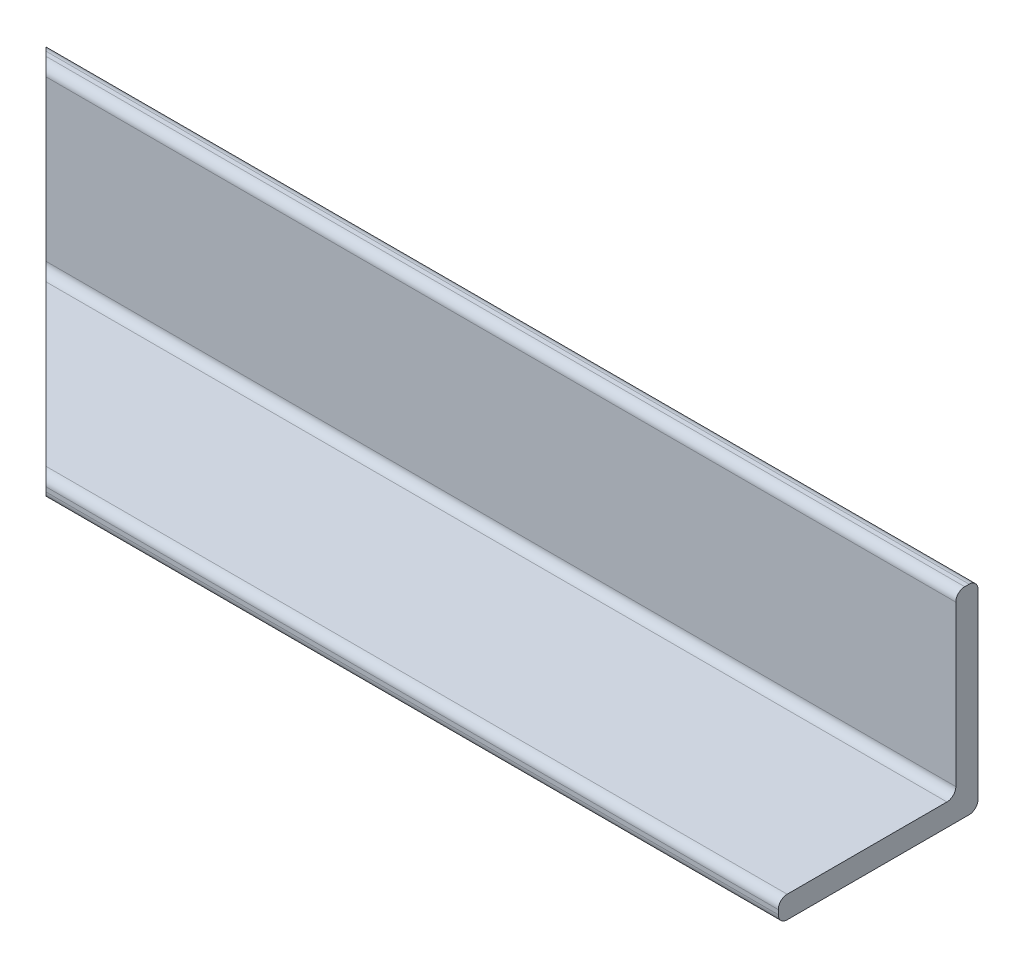
ISO-10303-21;
HEADER;
FILE_DESCRIPTION(('STEP AP214'),'2;1');
FILE_NAME('part.step','',(''),(''),'','','');
FILE_SCHEMA(('AUTOMOTIVE_DESIGN { 1 0 10303 214 1 1 1 1 }'));
ENDSEC;
DATA;
#1=APPLICATION_CONTEXT('core data for automotive mechanical design processes');
#2=APPLICATION_PROTOCOL_DEFINITION('international standard','automotive_design',2000,#1);
#3=PRODUCT_CONTEXT('',#1,'mechanical');
#4=PRODUCT('Part','Part','',(#3));
#5=PRODUCT_RELATED_PRODUCT_CATEGORY('part','',(#4));
#6=PRODUCT_DEFINITION_FORMATION('','',#4);
#7=PRODUCT_DEFINITION_CONTEXT('part definition',#1,'design');
#8=PRODUCT_DEFINITION('design','',#6,#7);
#9=PRODUCT_DEFINITION_SHAPE('','',#8);
#10=(LENGTH_UNIT() NAMED_UNIT(*) SI_UNIT(.MILLI.,.METRE.));
#11=(NAMED_UNIT(*) PLANE_ANGLE_UNIT() SI_UNIT($,.RADIAN.));
#12=(NAMED_UNIT(*) SI_UNIT($,.STERADIAN.) SOLID_ANGLE_UNIT());
#13=UNCERTAINTY_MEASURE_WITH_UNIT(LENGTH_MEASURE(1.E-05),#10,'distance_accuracy_value','');
#14=(GEOMETRIC_REPRESENTATION_CONTEXT(3) GLOBAL_UNCERTAINTY_ASSIGNED_CONTEXT((#13)) GLOBAL_UNIT_ASSIGNED_CONTEXT((#10,
#11,#12)) REPRESENTATION_CONTEXT('',''));
#15=CARTESIAN_POINT('',(0.,0.,0.));
#16=DIRECTION('',(0.,0.,1.));
#17=DIRECTION('',(1.,0.,0.));
#18=AXIS2_PLACEMENT_3D('',#15,#16,#17);
#19=CARTESIAN_POINT('',(52.5,2.5,-11.25));
#20=DIRECTION('',(-1.,0.,0.));
#21=DIRECTION('',(0.,0.,1.));
#22=AXIS2_PLACEMENT_3D('',#19,#20,#21);
#23=PLANE('',#22);
#24=DIRECTION('',(0.,0.,-1.));
#25=VECTOR('',#24,1.);
#26=CARTESIAN_POINT('',(52.5,0.,-11.25));
#27=LINE('',#26,#25);
#28=CARTESIAN_POINT('',(52.5,0.,10.25));
#29=VERTEX_POINT('',#28);
#30=CARTESIAN_POINT('',(52.5,0.,-10.25));
#31=VERTEX_POINT('',#30);
#32=EDGE_CURVE('E202',#29,#31,#27,.T.);
#33=ORIENTED_EDGE('',*,*,#32,.T.);
#34=CARTESIAN_POINT('',(52.5,1.,-10.25));
#35=DIRECTION('',(-1.,0.,0.));
#36=DIRECTION('',(0.,0.,1.));
#37=AXIS2_PLACEMENT_3D('',#34,#35,#36);
#38=CIRCLE('',#37,1.);
#39=CARTESIAN_POINT('',(52.5,1.,-11.25));
#40=VERTEX_POINT('',#39);
#41=EDGE_CURVE('E168',#31,#40,#38,.F.);
#42=ORIENTED_EDGE('',*,*,#41,.T.);
#43=DIRECTION('',(0.,-1.,0.));
#44=VECTOR('',#43,1.);
#45=CARTESIAN_POINT('',(52.5,2.5,-11.25));
#46=LINE('',#45,#44);
#47=CARTESIAN_POINT('',(52.5,21.5,-11.25));
#48=VERTEX_POINT('',#47);
#49=EDGE_CURVE('E143',#48,#40,#46,.T.);
#50=ORIENTED_EDGE('',*,*,#49,.F.);
#51=CARTESIAN_POINT('',(52.5,21.5,-10.25));
#52=DIRECTION('',(-1.,0.,0.));
#53=DIRECTION('',(0.,0.,1.));
#54=AXIS2_PLACEMENT_3D('',#51,#52,#53);
#55=CIRCLE('',#54,1.);
#56=CARTESIAN_POINT('',(52.5,22.5,-10.25));
#57=VERTEX_POINT('',#56);
#58=EDGE_CURVE('E148',#48,#57,#55,.F.);
#59=ORIENTED_EDGE('',*,*,#58,.T.);
#60=DIRECTION('',(0.,0.,-1.));
#61=VECTOR('',#60,1.);
#62=CARTESIAN_POINT('',(52.5,22.5,-11.25));
#63=LINE('',#62,#61);
#64=CARTESIAN_POINT('',(52.5,22.5,-9.75));
#65=VERTEX_POINT('',#64);
#66=EDGE_CURVE('E216',#65,#57,#63,.T.);
#67=ORIENTED_EDGE('',*,*,#66,.F.);
#68=CARTESIAN_POINT('',(52.5,21.5,-9.75));
#69=DIRECTION('',(-1.,0.,0.));
#70=DIRECTION('',(0.,0.,1.));
#71=AXIS2_PLACEMENT_3D('',#68,#69,#70);
#72=CIRCLE('',#71,1.);
#73=CARTESIAN_POINT('',(52.5,21.5,-8.75));
#74=VERTEX_POINT('',#73);
#75=EDGE_CURVE('E163',#65,#74,#72,.F.);
#76=ORIENTED_EDGE('',*,*,#75,.T.);
#77=DIRECTION('',(0.,-1.,0.));
#78=VECTOR('',#77,1.);
#79=CARTESIAN_POINT('',(52.5,22.5,-8.75));
#80=LINE('',#79,#78);
#81=CARTESIAN_POINT('',(52.5,3.5,-8.75));
#82=VERTEX_POINT('',#81);
#83=EDGE_CURVE('E193',#74,#82,#80,.T.);
#84=ORIENTED_EDGE('',*,*,#83,.T.);
#85=CARTESIAN_POINT('',(52.5,3.5,-7.75));
#86=DIRECTION('',(-1.,0.,0.));
#87=DIRECTION('',(0.,0.,1.));
#88=AXIS2_PLACEMENT_3D('',#85,#86,#87);
#89=CIRCLE('',#88,1.);
#90=CARTESIAN_POINT('',(52.5,2.5,-7.75));
#91=VERTEX_POINT('',#90);
#92=EDGE_CURVE('E40',#82,#91,#89,.T.);
#93=ORIENTED_EDGE('',*,*,#92,.T.);
#94=DIRECTION('',(0.,0.,-1.));
#95=VECTOR('',#94,1.);
#96=CARTESIAN_POINT('',(52.5,2.5,-11.25));
#97=LINE('',#96,#95);
#98=CARTESIAN_POINT('',(52.5,2.5,10.25));
#99=VERTEX_POINT('',#98);
#100=EDGE_CURVE('E191',#99,#91,#97,.T.);
#101=ORIENTED_EDGE('',*,*,#100,.F.);
#102=CARTESIAN_POINT('',(52.5,1.5,10.25));
#103=DIRECTION('',(-1.,0.,0.));
#104=DIRECTION('',(0.,0.,1.));
#105=AXIS2_PLACEMENT_3D('',#102,#103,#104);
#106=CIRCLE('',#105,1.);
#107=CARTESIAN_POINT('',(52.5,1.5,11.25));
#108=VERTEX_POINT('',#107);
#109=EDGE_CURVE('E55',#99,#108,#106,.F.);
#110=ORIENTED_EDGE('',*,*,#109,.T.);
#111=DIRECTION('',(0.,-1.,0.));
#112=VECTOR('',#111,1.);
#113=CARTESIAN_POINT('',(52.5,2.5,11.25));
#114=LINE('',#113,#112);
#115=CARTESIAN_POINT('',(52.5,1.,11.25));
#116=VERTEX_POINT('',#115);
#117=EDGE_CURVE('E144',#108,#116,#114,.T.);
#118=ORIENTED_EDGE('',*,*,#117,.T.);
#119=CARTESIAN_POINT('',(52.5,1.,10.25));
#120=DIRECTION('',(-1.,0.,0.));
#121=DIRECTION('',(0.,0.,1.));
#122=AXIS2_PLACEMENT_3D('',#119,#120,#121);
#123=CIRCLE('',#122,1.);
#124=EDGE_CURVE('E47',#116,#29,#123,.F.);
#125=ORIENTED_EDGE('',*,*,#124,.T.);
#126=EDGE_LOOP('',(#33,#42,#50,#59,#67,#76,#84,#93,#101,#110,#118,#125));
#127=FACE_BOUND('',#126,.T.);
#128=ADVANCED_FACE('F32',(#127),#23,.F.);
#129=CARTESIAN_POINT('',(-52.5,2.5,-11.25));
#130=DIRECTION('',(0.,0.,1.));
#131=DIRECTION('',(1.,0.,0.));
#132=AXIS2_PLACEMENT_3D('',#129,#130,#131);
#133=PLANE('',#132);
#134=ORIENTED_EDGE('',*,*,#49,.T.);
#135=DIRECTION('',(-1.,0.,0.));
#136=VECTOR('',#135,1.);
#137=CARTESIAN_POINT('',(-52.5,1.,-11.25));
#138=LINE('',#137,#136);
#139=CARTESIAN_POINT('',(-52.5,1.,-11.25));
#140=VERTEX_POINT('',#139);
#141=EDGE_CURVE('E142',#40,#140,#138,.T.);
#142=ORIENTED_EDGE('',*,*,#141,.T.);
#143=DIRECTION('',(0.,-1.,0.));
#144=VECTOR('',#143,1.);
#145=CARTESIAN_POINT('',(-52.5,2.5,-11.25));
#146=LINE('',#145,#144);
#147=CARTESIAN_POINT('',(-52.5,21.5,-11.25));
#148=VERTEX_POINT('',#147);
#149=EDGE_CURVE('E125',#148,#140,#146,.T.);
#150=ORIENTED_EDGE('',*,*,#149,.F.);
#151=DIRECTION('',(-1.,0.,0.));
#152=VECTOR('',#151,1.);
#153=CARTESIAN_POINT('',(52.5,21.5,-11.25));
#154=LINE('',#153,#152);
#155=EDGE_CURVE('E139',#148,#48,#154,.F.);
#156=ORIENTED_EDGE('',*,*,#155,.T.);
#157=EDGE_LOOP('',(#134,#142,#150,#156));
#158=FACE_BOUND('',#157,.T.);
#159=ADVANCED_FACE('F138',(#158),#133,.F.);
#160=CARTESIAN_POINT('',(-52.5,2.5,11.25));
#161=DIRECTION('',(0.,0.,-1.));
#162=DIRECTION('',(-1.,0.,0.));
#163=AXIS2_PLACEMENT_3D('',#160,#161,#162);
#164=PLANE('',#163);
#165=DIRECTION('',(0.,-1.,0.));
#166=VECTOR('',#165,1.);
#167=CARTESIAN_POINT('',(-30.0000000000003,22.5,11.25));
#168=LINE('',#167,#166);
#169=CARTESIAN_POINT('',(-30.0000000000003,1.50000000000001,11.25));
#170=VERTEX_POINT('',#169);
#171=CARTESIAN_POINT('',(-30.0000000000003,1.00000000000001,11.25));
#172=VERTEX_POINT('',#171);
#173=EDGE_CURVE('E214',#170,#172,#168,.T.);
#174=ORIENTED_EDGE('',*,*,#173,.T.);
#175=DIRECTION('',(1.,0.,0.));
#176=VECTOR('',#175,1.);
#177=CARTESIAN_POINT('',(-52.5,1.,11.25));
#178=LINE('',#177,#176);
#179=EDGE_CURVE('E172',#172,#116,#178,.T.);
#180=ORIENTED_EDGE('',*,*,#179,.T.);
#181=ORIENTED_EDGE('',*,*,#117,.F.);
#182=DIRECTION('',(1.,0.,0.));
#183=VECTOR('',#182,1.);
#184=CARTESIAN_POINT('',(-30.0000000000003,1.5,11.25));
#185=LINE('',#184,#183);
#186=EDGE_CURVE('E170',#108,#170,#185,.F.);
#187=ORIENTED_EDGE('',*,*,#186,.T.);
#188=EDGE_LOOP('',(#174,#180,#181,#187));
#189=FACE_BOUND('',#188,.T.);
#190=ADVANCED_FACE('F229',(#189),#164,.F.);
#191=CARTESIAN_POINT('',(0.,2.5,0.));
#192=DIRECTION('',(0.,1.,0.));
#193=DIRECTION('',(0.,0.,1.));
#194=AXIS2_PLACEMENT_3D('',#191,#192,#193);
#195=PLANE('',#194);
#196=DIRECTION('',(-0.707106781186544,0.,-0.707106781186551));
#197=VECTOR('',#196,1.);
#198=CARTESIAN_POINT('',(-20.6250000000003,2.5,20.6250000000001));
#199=LINE('',#198,#197);
#200=CARTESIAN_POINT('',(-31.0000000000002,2.5,10.25));
#201=VERTEX_POINT('',#200);
#202=CARTESIAN_POINT('',(-49.,2.5,-7.75));
#203=VERTEX_POINT('',#202);
#204=EDGE_CURVE('E210',#201,#203,#199,.T.);
#205=ORIENTED_EDGE('',*,*,#204,.F.);
#206=DIRECTION('',(1.,0.,0.));
#207=VECTOR('',#206,1.);
#208=CARTESIAN_POINT('',(52.5,2.5,10.25));
#209=LINE('',#208,#207);
#210=EDGE_CURVE('E176',#201,#99,#209,.T.);
#211=ORIENTED_EDGE('',*,*,#210,.T.);
#212=ORIENTED_EDGE('',*,*,#100,.T.);
#213=DIRECTION('',(1.,0.,0.));
#214=VECTOR('',#213,1.);
#215=CARTESIAN_POINT('',(0.,2.5,-7.75));
#216=LINE('',#215,#214);
#217=EDGE_CURVE('E174',#91,#203,#216,.F.);
#218=ORIENTED_EDGE('',*,*,#217,.T.);
#219=EDGE_LOOP('',(#205,#211,#212,#218));
#220=FACE_BOUND('',#219,.T.);
#221=ADVANCED_FACE('F199',(#220),#195,.T.);
#222=CARTESIAN_POINT('',(0.,0.,0.));
#223=DIRECTION('',(0.,1.,0.));
#224=DIRECTION('',(0.,0.,1.));
#225=AXIS2_PLACEMENT_3D('',#222,#223,#224);
#226=PLANE('',#225);
#227=DIRECTION('',(0.707106781186544,0.,0.707106781186551));
#228=VECTOR('',#227,1.);
#229=CARTESIAN_POINT('',(-52.5,0.,-11.25));
#230=LINE('',#229,#228);
#231=CARTESIAN_POINT('',(-51.5,0.,-10.25));
#232=VERTEX_POINT('',#231);
#233=CARTESIAN_POINT('',(-31.0000000000002,0.,10.25));
#234=VERTEX_POINT('',#233);
#235=EDGE_CURVE('E240',#232,#234,#230,.T.);
#236=ORIENTED_EDGE('',*,*,#235,.F.);
#237=DIRECTION('',(-1.,0.,0.));
#238=VECTOR('',#237,1.);
#239=CARTESIAN_POINT('',(0.,0.,-10.25));
#240=LINE('',#239,#238);
#241=EDGE_CURVE('E161',#232,#31,#240,.F.);
#242=ORIENTED_EDGE('',*,*,#241,.T.);
#243=ORIENTED_EDGE('',*,*,#32,.F.);
#244=DIRECTION('',(1.,0.,0.));
#245=VECTOR('',#244,1.);
#246=CARTESIAN_POINT('',(0.,0.,10.25));
#247=LINE('',#246,#245);
#248=EDGE_CURVE('E159',#29,#234,#247,.F.);
#249=ORIENTED_EDGE('',*,*,#248,.T.);
#250=EDGE_LOOP('',(#236,#242,#243,#249));
#251=FACE_BOUND('',#250,.T.);
#252=ADVANCED_FACE('F239',(#251),#226,.F.);
#253=CARTESIAN_POINT('',(-52.5,22.5,-8.75));
#254=DIRECTION('',(0.,0.,-1.));
#255=DIRECTION('',(-1.,0.,0.));
#256=AXIS2_PLACEMENT_3D('',#253,#254,#255);
#257=PLANE('',#256);
#258=DIRECTION('',(0.,-1.,0.));
#259=VECTOR('',#258,1.);
#260=CARTESIAN_POINT('',(-50.,22.5,-8.75));
#261=LINE('',#260,#259);
#262=CARTESIAN_POINT('',(-50.,21.5,-8.75));
#263=VERTEX_POINT('',#262);
#264=CARTESIAN_POINT('',(-50.,3.5,-8.75));
#265=VERTEX_POINT('',#264);
#266=EDGE_CURVE('E208',#263,#265,#261,.T.);
#267=ORIENTED_EDGE('',*,*,#266,.T.);
#268=DIRECTION('',(1.,0.,0.));
#269=VECTOR('',#268,1.);
#270=CARTESIAN_POINT('',(-52.5,3.5,-8.75));
#271=LINE('',#270,#269);
#272=EDGE_CURVE('E181',#265,#82,#271,.T.);
#273=ORIENTED_EDGE('',*,*,#272,.T.);
#274=ORIENTED_EDGE('',*,*,#83,.F.);
#275=DIRECTION('',(1.,0.,0.));
#276=VECTOR('',#275,1.);
#277=CARTESIAN_POINT('',(-50.,21.5,-8.75));
#278=LINE('',#277,#276);
#279=EDGE_CURVE('E179',#74,#263,#278,.F.);
#280=ORIENTED_EDGE('',*,*,#279,.T.);
#281=EDGE_LOOP('',(#267,#273,#274,#280));
#282=FACE_BOUND('',#281,.T.);
#283=ADVANCED_FACE('F212',(#282),#257,.F.);
#284=CARTESIAN_POINT('',(0.,22.5,0.));
#285=DIRECTION('',(0.,1.,0.));
#286=DIRECTION('',(0.,0.,1.));
#287=AXIS2_PLACEMENT_3D('',#284,#285,#286);
#288=PLANE('',#287);
#289=ORIENTED_EDGE('',*,*,#66,.T.);
#290=DIRECTION('',(-1.,0.,0.));
#291=VECTOR('',#290,1.);
#292=CARTESIAN_POINT('',(-52.5,22.5,-10.25));
#293=LINE('',#292,#291);
#294=CARTESIAN_POINT('',(-51.5,22.5,-10.25));
#295=VERTEX_POINT('',#294);
#296=EDGE_CURVE('E187',#57,#295,#293,.T.);
#297=ORIENTED_EDGE('',*,*,#296,.T.);
#298=DIRECTION('',(0.707106781186544,0.,0.707106781186551));
#299=VECTOR('',#298,1.);
#300=CARTESIAN_POINT('',(-52.5,22.5,-11.25));
#301=LINE('',#300,#299);
#302=CARTESIAN_POINT('',(-51.,22.5,-9.75));
#303=VERTEX_POINT('',#302);
#304=EDGE_CURVE('E127',#295,#303,#301,.T.);
#305=ORIENTED_EDGE('',*,*,#304,.T.);
#306=DIRECTION('',(1.,0.,0.));
#307=VECTOR('',#306,1.);
#308=CARTESIAN_POINT('',(52.5,22.5,-9.75));
#309=LINE('',#308,#307);
#310=EDGE_CURVE('E184',#303,#65,#309,.T.);
#311=ORIENTED_EDGE('',*,*,#310,.T.);
#312=EDGE_LOOP('',(#289,#297,#305,#311));
#313=FACE_BOUND('',#312,.T.);
#314=ADVANCED_FACE('F245',(#313),#288,.T.);
#315=CARTESIAN_POINT('',(-52.5,22.5,-11.25));
#316=DIRECTION('',(0.707106781186551,0.,-0.707106781186544));
#317=DIRECTION('',(-0.707106781186544,0.,-0.707106781186551));
#318=AXIS2_PLACEMENT_3D('',#315,#316,#317);
#319=PLANE('',#318);
#320=ORIENTED_EDGE('',*,*,#149,.T.);
#321=CARTESIAN_POINT('',(-51.5,1.,-10.25));
#322=DIRECTION('',(0.707106781186551,0.,-0.707106781186544));
#323=DIRECTION('',(-0.707106781186544,0.,-0.707106781186551));
#324=AXIS2_PLACEMENT_3D('',#321,#322,#323);
#325=ELLIPSE('',#324,1.41421356237309,1.);
#326=EDGE_CURVE('E157',#140,#232,#325,.F.);
#327=ORIENTED_EDGE('',*,*,#326,.T.);
#328=ORIENTED_EDGE('',*,*,#235,.T.);
#329=CARTESIAN_POINT('',(-31.0000000000002,1.,10.25));
#330=DIRECTION('',(0.707106781186551,0.,-0.707106781186544));
#331=DIRECTION('',(0.707106781186544,0.,0.707106781186551));
#332=AXIS2_PLACEMENT_3D('',#329,#330,#331);
#333=ELLIPSE('',#332,1.41421356237309,1.);
#334=EDGE_CURVE('E155',#234,#172,#333,.F.);
#335=ORIENTED_EDGE('',*,*,#334,.T.);
#336=ORIENTED_EDGE('',*,*,#173,.F.);
#337=CARTESIAN_POINT('',(-31.0000000000002,1.5,10.25));
#338=DIRECTION('',(0.707106781186551,0.,-0.707106781186544));
#339=DIRECTION('',(-0.707106781186544,0.,-0.707106781186551));
#340=AXIS2_PLACEMENT_3D('',#337,#338,#339);
#341=ELLIPSE('',#340,1.41421356237309,1.);
#342=EDGE_CURVE('E132',#170,#201,#341,.F.);
#343=ORIENTED_EDGE('',*,*,#342,.T.);
#344=ORIENTED_EDGE('',*,*,#204,.T.);
#345=CARTESIAN_POINT('',(-49.,3.5,-7.75));
#346=DIRECTION('',(0.707106781186551,0.,-0.707106781186544));
#347=DIRECTION('',(0.707106781186544,0.,0.707106781186551));
#348=AXIS2_PLACEMENT_3D('',#345,#346,#347);
#349=ELLIPSE('',#348,1.41421356237309,1.);
#350=EDGE_CURVE('E11',#203,#265,#349,.T.);
#351=ORIENTED_EDGE('',*,*,#350,.T.);
#352=ORIENTED_EDGE('',*,*,#266,.F.);
#353=CARTESIAN_POINT('',(-51.,21.5,-9.75));
#354=DIRECTION('',(0.707106781186551,0.,-0.707106781186544));
#355=DIRECTION('',(-0.707106781186544,0.,-0.707106781186551));
#356=AXIS2_PLACEMENT_3D('',#353,#354,#355);
#357=ELLIPSE('',#356,1.41421356237309,1.);
#358=EDGE_CURVE('E133',#263,#303,#357,.F.);
#359=ORIENTED_EDGE('',*,*,#358,.T.);
#360=ORIENTED_EDGE('',*,*,#304,.F.);
#361=CARTESIAN_POINT('',(-51.5,21.5,-10.25));
#362=DIRECTION('',(0.707106781186551,0.,-0.707106781186544));
#363=DIRECTION('',(0.707106781186544,0.,0.707106781186551));
#364=AXIS2_PLACEMENT_3D('',#361,#362,#363);
#365=ELLIPSE('',#364,1.41421356237309,1.);
#366=EDGE_CURVE('E122',#295,#148,#365,.F.);
#367=ORIENTED_EDGE('',*,*,#366,.T.);
#368=EDGE_LOOP('',(#320,#327,#328,#335,#336,#343,#344,#351,#352,#359,#360,#367));
#369=FACE_BOUND('',#368,.T.);
#370=ADVANCED_FACE('F124',(#369),#319,.F.);
#371=CARTESIAN_POINT('',(-52.5,1.,-10.25));
#372=DIRECTION('',(-1.,0.,0.));
#373=DIRECTION('',(0.,0.,1.));
#374=AXIS2_PLACEMENT_3D('',#371,#372,#373);
#375=CYLINDRICAL_SURFACE('',#374,1.);
#376=ORIENTED_EDGE('',*,*,#41,.F.);
#377=ORIENTED_EDGE('',*,*,#241,.F.);
#378=ORIENTED_EDGE('',*,*,#326,.F.);
#379=ORIENTED_EDGE('',*,*,#141,.F.);
#380=EDGE_LOOP('',(#376,#377,#378,#379));
#381=FACE_BOUND('',#380,.T.);
#382=ADVANCED_FACE('F250',(#381),#375,.T.);
#383=CARTESIAN_POINT('',(-52.5,1.,10.25));
#384=DIRECTION('',(1.,0.,0.));
#385=DIRECTION('',(0.,0.,-1.));
#386=AXIS2_PLACEMENT_3D('',#383,#384,#385);
#387=CYLINDRICAL_SURFACE('',#386,1.);
#388=ORIENTED_EDGE('',*,*,#334,.F.);
#389=ORIENTED_EDGE('',*,*,#248,.F.);
#390=ORIENTED_EDGE('',*,*,#124,.F.);
#391=ORIENTED_EDGE('',*,*,#179,.F.);
#392=EDGE_LOOP('',(#388,#389,#390,#391));
#393=FACE_BOUND('',#392,.T.);
#394=ADVANCED_FACE('F236',(#393),#387,.T.);
#395=CARTESIAN_POINT('',(0.,1.5,10.25));
#396=DIRECTION('',(-1.,0.,0.));
#397=DIRECTION('',(0.,0.,1.));
#398=AXIS2_PLACEMENT_3D('',#395,#396,#397);
#399=CYLINDRICAL_SURFACE('',#398,1.);
#400=ORIENTED_EDGE('',*,*,#342,.F.);
#401=ORIENTED_EDGE('',*,*,#186,.F.);
#402=ORIENTED_EDGE('',*,*,#109,.F.);
#403=ORIENTED_EDGE('',*,*,#210,.F.);
#404=EDGE_LOOP('',(#400,#401,#402,#403));
#405=FACE_BOUND('',#404,.T.);
#406=ADVANCED_FACE('F233',(#405),#399,.T.);
#407=CARTESIAN_POINT('',(-52.5,3.5,-7.75));
#408=DIRECTION('',(1.,0.,0.));
#409=DIRECTION('',(0.,0.,-1.));
#410=AXIS2_PLACEMENT_3D('',#407,#408,#409);
#411=CYLINDRICAL_SURFACE('',#410,1.);
#412=ORIENTED_EDGE('',*,*,#350,.F.);
#413=ORIENTED_EDGE('',*,*,#217,.F.);
#414=ORIENTED_EDGE('',*,*,#92,.F.);
#415=ORIENTED_EDGE('',*,*,#272,.F.);
#416=EDGE_LOOP('',(#412,#413,#414,#415));
#417=FACE_BOUND('',#416,.T.);
#418=ADVANCED_FACE('F205',(#417),#411,.F.);
#419=CARTESIAN_POINT('',(0.,21.5,-10.25));
#420=DIRECTION('',(1.,0.,0.));
#421=DIRECTION('',(0.,0.,-1.));
#422=AXIS2_PLACEMENT_3D('',#419,#420,#421);
#423=CYLINDRICAL_SURFACE('',#422,1.);
#424=ORIENTED_EDGE('',*,*,#58,.F.);
#425=ORIENTED_EDGE('',*,*,#155,.F.);
#426=ORIENTED_EDGE('',*,*,#366,.F.);
#427=ORIENTED_EDGE('',*,*,#296,.F.);
#428=EDGE_LOOP('',(#424,#425,#426,#427));
#429=FACE_BOUND('',#428,.T.);
#430=ADVANCED_FACE('F147',(#429),#423,.T.);
#431=CARTESIAN_POINT('',(0.,21.5,-9.75));
#432=DIRECTION('',(-1.,0.,0.));
#433=DIRECTION('',(0.,0.,1.));
#434=AXIS2_PLACEMENT_3D('',#431,#432,#433);
#435=CYLINDRICAL_SURFACE('',#434,1.);
#436=ORIENTED_EDGE('',*,*,#358,.F.);
#437=ORIENTED_EDGE('',*,*,#279,.F.);
#438=ORIENTED_EDGE('',*,*,#75,.F.);
#439=ORIENTED_EDGE('',*,*,#310,.F.);
#440=EDGE_LOOP('',(#436,#437,#438,#439));
#441=FACE_BOUND('',#440,.T.);
#442=ADVANCED_FACE('F34',(#441),#435,.T.);
#443=CLOSED_SHELL('',(#128,#159,#190,#221,#252,#283,#314,#370,#382,#394,#406,#418,#430,#442));
#444=MANIFOLD_SOLID_BREP('B2',#443);
#445=ADVANCED_BREP_SHAPE_REPRESENTATION('',(#18,#444),#14);
#446=SHAPE_DEFINITION_REPRESENTATION(#9,#445);
ENDSEC;
END-ISO-10303-21;
